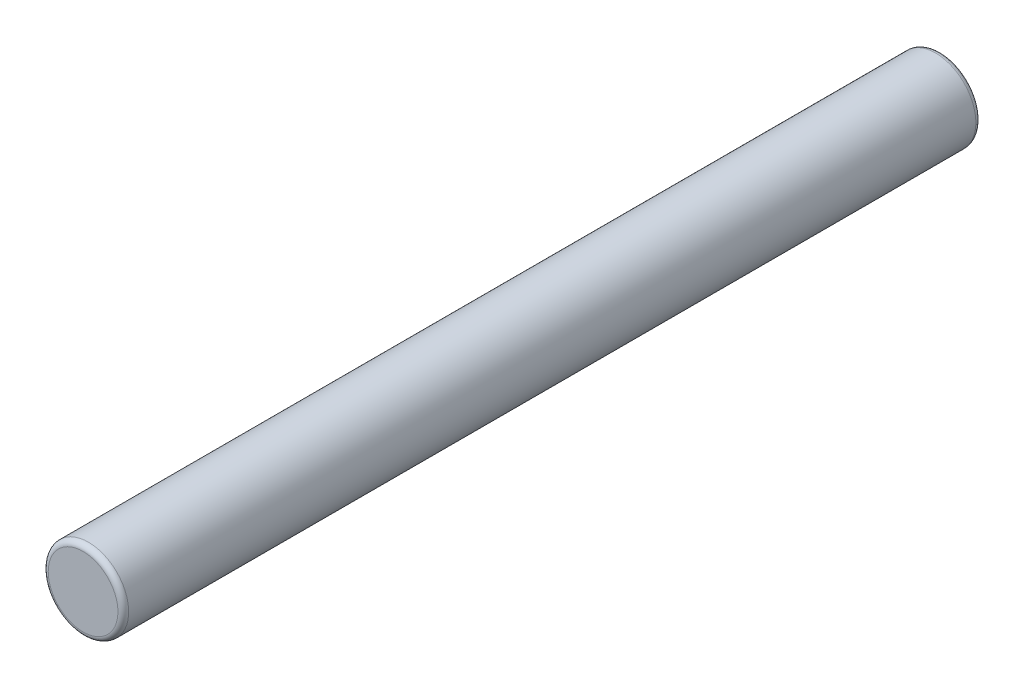
ISO-10303-21;
HEADER;
FILE_DESCRIPTION(('STEP AP214'),'2;1');
FILE_NAME('part.step','',(''),(''),'','','');
FILE_SCHEMA(('AUTOMOTIVE_DESIGN { 1 0 10303 214 1 1 1 1 }'));
ENDSEC;
DATA;
#1=APPLICATION_CONTEXT('core data for automotive mechanical design processes');
#2=APPLICATION_PROTOCOL_DEFINITION('international standard','automotive_design',2000,#1);
#3=PRODUCT_CONTEXT('',#1,'mechanical');
#4=PRODUCT('Part','Part','',(#3));
#5=PRODUCT_RELATED_PRODUCT_CATEGORY('part','',(#4));
#6=PRODUCT_DEFINITION_FORMATION('','',#4);
#7=PRODUCT_DEFINITION_CONTEXT('part definition',#1,'design');
#8=PRODUCT_DEFINITION('design','',#6,#7);
#9=PRODUCT_DEFINITION_SHAPE('','',#8);
#10=(LENGTH_UNIT() NAMED_UNIT(*) SI_UNIT(.MILLI.,.METRE.));
#11=(NAMED_UNIT(*) PLANE_ANGLE_UNIT() SI_UNIT($,.RADIAN.));
#12=(NAMED_UNIT(*) SI_UNIT($,.STERADIAN.) SOLID_ANGLE_UNIT());
#13=UNCERTAINTY_MEASURE_WITH_UNIT(LENGTH_MEASURE(1.E-05),#10,'distance_accuracy_value','');
#14=(GEOMETRIC_REPRESENTATION_CONTEXT(3) GLOBAL_UNCERTAINTY_ASSIGNED_CONTEXT((#13)) GLOBAL_UNIT_ASSIGNED_CONTEXT((#10,
#11,#12)) REPRESENTATION_CONTEXT('',''));
#15=CARTESIAN_POINT('',(0.,0.,0.));
#16=DIRECTION('',(0.,0.,1.));
#17=DIRECTION('',(1.,0.,0.));
#18=AXIS2_PLACEMENT_3D('',#15,#16,#17);
#19=CARTESIAN_POINT('',(0.,0.,15.8));
#20=DIRECTION('',(0.,0.,-1.));
#21=DIRECTION('',(-1.,0.,0.));
#22=AXIS2_PLACEMENT_3D('',#19,#20,#21);
#23=TOROIDAL_SURFACE('',#22,1.3,0.199999999999999);
#24=CARTESIAN_POINT('',(0.,0.,16.));
#25=DIRECTION('',(0.,0.,-1.));
#26=DIRECTION('',(-1.,0.,0.));
#27=AXIS2_PLACEMENT_3D('',#24,#25,#26);
#28=CIRCLE('',#27,1.3);
#29=CARTESIAN_POINT('',(-1.3,0.,16.));
#30=VERTEX_POINT('',#29);
#31=EDGE_CURVE('E10',#30,#30,#28,.T.);
#32=ORIENTED_EDGE('',*,*,#31,.T.);
#33=EDGE_LOOP('',(#32));
#34=FACE_BOUND('',#33,.T.);
#35=CARTESIAN_POINT('',(0.,0.,15.8));
#36=DIRECTION('',(0.,0.,-1.));
#37=DIRECTION('',(-1.,0.,0.));
#38=AXIS2_PLACEMENT_3D('',#35,#36,#37);
#39=CIRCLE('',#38,1.5);
#40=CARTESIAN_POINT('',(-1.5,0.,15.8));
#41=VERTEX_POINT('',#40);
#42=EDGE_CURVE('E46',#41,#41,#39,.T.);
#43=ORIENTED_EDGE('',*,*,#42,.F.);
#44=EDGE_LOOP('',(#43));
#45=FACE_BOUND('',#44,.T.);
#46=ADVANCED_FACE('F32',(#34,#45),#23,.T.);
#47=CARTESIAN_POINT('',(1.3,0.,16.));
#48=DIRECTION('',(0.,0.,1.));
#49=DIRECTION('',(1.,0.,0.));
#50=AXIS2_PLACEMENT_3D('',#47,#48,#49);
#51=PLANE('',#50);
#52=ORIENTED_EDGE('',*,*,#31,.F.);
#53=EDGE_LOOP('',(#52));
#54=FACE_BOUND('',#53,.T.);
#55=ADVANCED_FACE('F56',(#54),#51,.T.);
#56=CARTESIAN_POINT('',(0.,0.,-16.));
#57=DIRECTION('',(0.,0.,-1.));
#58=DIRECTION('',(-1.,0.,0.));
#59=AXIS2_PLACEMENT_3D('',#56,#57,#58);
#60=PLANE('',#59);
#61=CARTESIAN_POINT('',(0.,0.,-16.));
#62=DIRECTION('',(0.,0.,-1.));
#63=DIRECTION('',(-1.,0.,0.));
#64=AXIS2_PLACEMENT_3D('',#61,#62,#63);
#65=CIRCLE('',#64,1.3);
#66=CARTESIAN_POINT('',(-1.3,0.,-16.));
#67=VERTEX_POINT('',#66);
#68=EDGE_CURVE('E38',#67,#67,#65,.T.);
#69=ORIENTED_EDGE('',*,*,#68,.T.);
#70=EDGE_LOOP('',(#69));
#71=FACE_BOUND('',#70,.T.);
#72=ADVANCED_FACE('F60',(#71),#60,.T.);
#73=CARTESIAN_POINT('',(0.,0.,-15.8));
#74=DIRECTION('',(0.,0.,-1.));
#75=DIRECTION('',(-1.,0.,0.));
#76=AXIS2_PLACEMENT_3D('',#73,#74,#75);
#77=TOROIDAL_SURFACE('',#76,1.3,0.199999999999999);
#78=CARTESIAN_POINT('',(0.,0.,-15.8));
#79=DIRECTION('',(0.,0.,-1.));
#80=DIRECTION('',(-1.,0.,0.));
#81=AXIS2_PLACEMENT_3D('',#78,#79,#80);
#82=CIRCLE('',#81,1.5);
#83=CARTESIAN_POINT('',(-1.5,0.,-15.8));
#84=VERTEX_POINT('',#83);
#85=EDGE_CURVE('E42',#84,#84,#82,.T.);
#86=ORIENTED_EDGE('',*,*,#85,.T.);
#87=EDGE_LOOP('',(#86));
#88=FACE_BOUND('',#87,.T.);
#89=ORIENTED_EDGE('',*,*,#68,.F.);
#90=EDGE_LOOP('',(#89));
#91=FACE_BOUND('',#90,.T.);
#92=ADVANCED_FACE('F65',(#88,#91),#77,.T.);
#93=CARTESIAN_POINT('',(0.,0.,16.));
#94=DIRECTION('',(0.,0.,-1.));
#95=DIRECTION('',(-1.,0.,0.));
#96=AXIS2_PLACEMENT_3D('',#93,#94,#95);
#97=CYLINDRICAL_SURFACE('',#96,1.5);
#98=ORIENTED_EDGE('',*,*,#42,.T.);
#99=EDGE_LOOP('',(#98));
#100=FACE_BOUND('',#99,.T.);
#101=ORIENTED_EDGE('',*,*,#85,.F.);
#102=EDGE_LOOP('',(#101));
#103=FACE_BOUND('',#102,.T.);
#104=ADVANCED_FACE('F52',(#100,#103),#97,.T.);
#105=CLOSED_SHELL('',(#46,#55,#72,#92,#104));
#106=MANIFOLD_SOLID_BREP('B2',#105);
#107=ADVANCED_BREP_SHAPE_REPRESENTATION('',(#18,#106),#14);
#108=SHAPE_DEFINITION_REPRESENTATION(#9,#107);
ENDSEC;
END-ISO-10303-21;
